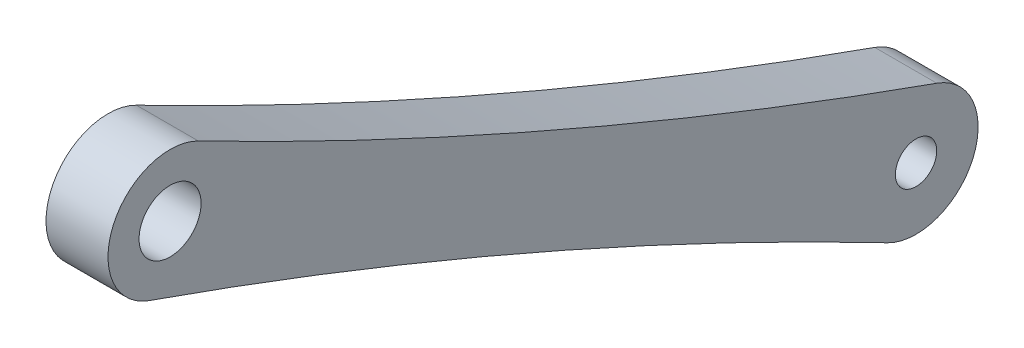
ISO-10303-21;
HEADER;
FILE_DESCRIPTION(('STEP AP214'),'2;1');
FILE_NAME('part.step','',(''),(''),'','','');
FILE_SCHEMA(('AUTOMOTIVE_DESIGN { 1 0 10303 214 1 1 1 1 }'));
ENDSEC;
DATA;
#1=APPLICATION_CONTEXT('core data for automotive mechanical design processes');
#2=APPLICATION_PROTOCOL_DEFINITION('international standard','automotive_design',2000,#1);
#3=PRODUCT_CONTEXT('',#1,'mechanical');
#4=PRODUCT('Part','Part','',(#3));
#5=PRODUCT_RELATED_PRODUCT_CATEGORY('part','',(#4));
#6=PRODUCT_DEFINITION_FORMATION('','',#4);
#7=PRODUCT_DEFINITION_CONTEXT('part definition',#1,'design');
#8=PRODUCT_DEFINITION('design','',#6,#7);
#9=PRODUCT_DEFINITION_SHAPE('','',#8);
#10=(LENGTH_UNIT() NAMED_UNIT(*) SI_UNIT(.MILLI.,.METRE.));
#11=(NAMED_UNIT(*) PLANE_ANGLE_UNIT() SI_UNIT($,.RADIAN.));
#12=(NAMED_UNIT(*) SI_UNIT($,.STERADIAN.) SOLID_ANGLE_UNIT());
#13=UNCERTAINTY_MEASURE_WITH_UNIT(LENGTH_MEASURE(1.E-05),#10,'distance_accuracy_value','');
#14=(GEOMETRIC_REPRESENTATION_CONTEXT(3) GLOBAL_UNCERTAINTY_ASSIGNED_CONTEXT((#13)) GLOBAL_UNIT_ASSIGNED_CONTEXT((#10,
#11,#12)) REPRESENTATION_CONTEXT('',''));
#15=CARTESIAN_POINT('',(0.,0.,0.));
#16=DIRECTION('',(0.,0.,1.));
#17=DIRECTION('',(1.,0.,0.));
#18=AXIS2_PLACEMENT_3D('',#15,#16,#17);
#19=CARTESIAN_POINT('',(4.5,21.8782646398546,117.17459809038));
#20=DIRECTION('',(1.,0.,0.));
#21=DIRECTION('',(0.,0.,-1.));
#22=AXIS2_PLACEMENT_3D('',#19,#20,#21);
#23=PLANE('',#22);
#24=CARTESIAN_POINT('',(4.5,51.9172732102553,39.9711419700113));
#25=DIRECTION('',(1.,0.,0.));
#26=DIRECTION('',(0.,0.,-1.));
#27=AXIS2_PLACEMENT_3D('',#24,#25,#26);
#28=CIRCLE('',#27,2.);
#29=CARTESIAN_POINT('',(4.5,51.9172732102553,37.9711419700113));
#30=VERTEX_POINT('',#29);
#31=EDGE_CURVE('E11',#30,#30,#28,.T.);
#32=ORIENTED_EDGE('',*,*,#31,.F.);
#33=EDGE_LOOP('',(#32));
#34=FACE_BOUND('',#33,.T.);
#35=CARTESIAN_POINT('',(4.5,83.1007540725639,112.120643155467));
#36=DIRECTION('',(1.,0.,0.));
#37=DIRECTION('',(0.,0.,-1.));
#38=AXIS2_PLACEMENT_3D('',#35,#36,#37);
#39=CIRCLE('',#38,3.00000000000001);
#40=CARTESIAN_POINT('',(4.5,83.1007540725639,109.120643155467));
#41=VERTEX_POINT('',#40);
#42=EDGE_CURVE('E154',#41,#41,#39,.T.);
#43=ORIENTED_EDGE('',*,*,#42,.F.);
#44=EDGE_LOOP('',(#43));
#45=FACE_BOUND('',#44,.T.);
#46=CARTESIAN_POINT('',(4.500012,603.870455787238,-155.772990334907));
#47=DIRECTION('',(1.,0.,0.));
#48=DIRECTION('',(0.,-0.889239728368869,0.457441477667319));
#49=AXIS2_PLACEMENT_3D('',#46,#47,#48);
#50=CIRCLE('',#49,579.634767656997);
#51=CARTESIAN_POINT('',(4.500006,88.4361924427772,109.375994289463));
#52=VERTEX_POINT('',#51);
#53=CARTESIAN_POINT('',(4.500006,57.5721954900773,37.965685909866));
#54=VERTEX_POINT('',#53);
#55=EDGE_CURVE('E91',#52,#54,#50,.T.);
#56=ORIENTED_EDGE('',*,*,#55,.F.);
#57=CARTESIAN_POINT('',(4.5,88.4361924427771,109.375994289463));
#58=CARTESIAN_POINT('',(4.5,89.0067273458961,110.485081084262));
#59=CARTESIAN_POINT('',(4.5,89.0880372999586,111.730208071287));
#60=CARTESIAN_POINT('',(4.5,89.1692944044217,112.974525754417));
#61=CARTESIAN_POINT('',(4.5,88.7474526666865,114.149138900381));
#62=CARTESIAN_POINT('',(4.5,88.325981742287,115.322719521158));
#63=CARTESIAN_POINT('',(4.5,87.4708925674688,116.231833924009));
#64=CARTESIAN_POINT('',(4.5,86.6165550452972,117.140149184189));
#65=CARTESIAN_POINT('',(4.5,85.4699547905982,117.633073468647));
#66=CARTESIAN_POINT('',(4.5,84.3243624367274,118.125564455804));
#67=CARTESIAN_POINT('',(4.5,83.076307236675,118.120593351278));
#68=CARTESIAN_POINT('',(4.5,81.8293491198367,118.115626616523));
#69=CARTESIAN_POINT('',(4.5,80.6867118980828,117.613584114536));
#70=CARTESIAN_POINT('',(4.5,79.5450790935612,117.111982925095));
#71=CARTESIAN_POINT('',(4.5,78.697259087272,116.196085697634));
#72=CARTESIAN_POINT('',(4.5,77.8499899289964,115.280783549512));
#73=CARTESIAN_POINT('',(4.5,77.4377130001774,114.103057292942));
#74=B_SPLINE_CURVE_WITH_KNOTS('',2,(#57,#58,#59,#60,#61,#62,#63,#64,#65,#66,#67,#68,#69,#70,#71,
#72,#73),.UNSPECIFIED.,.F.,.F.,(3,2,2,2,2,2,2,2,3),(0.,0.125,0.25,0.375,0.5,0.625,0.75,0.875,
1.),.UNSPECIFIED.);
#75=CARTESIAN_POINT('',(4.500006,77.4377130001774,114.103057292942));
#76=VERTEX_POINT('',#75);
#77=EDGE_CURVE('E103',#52,#76,#74,.T.);
#78=ORIENTED_EDGE('',*,*,#77,.T.);
#79=CARTESIAN_POINT('',(4.500012,-438.096598266388,294.571906793604));
#80=DIRECTION('',(1.,0.,0.));
#81=DIRECTION('',(0.,0.887340540482324,-0.461114698547484));
#82=AXIS2_PLACEMENT_3D('',#79,#80,#81);
#83=CIRCLE('',#82,546.209329591855);
#84=CARTESIAN_POINT('',(4.5,46.5770834701371,42.7067564350325));
#85=VERTEX_POINT('',#84);
#86=EDGE_CURVE('E151',#85,#76,#83,.T.);
#87=ORIENTED_EDGE('',*,*,#86,.F.);
#88=DIRECTION('',(0.,-0.450754172584189,-0.892648125465988));
#89=VECTOR('',#88,1.);
#90=CARTESIAN_POINT('',(4.5,46.5770834701371,42.7067564350325));
#91=LINE('',#90,#89);
#92=CARTESIAN_POINT('',(4.5,46.5613844611729,42.6756670036397));
#93=VERTEX_POINT('',#92);
#94=EDGE_CURVE('E56',#85,#93,#91,.T.);
#95=ORIENTED_EDGE('',*,*,#94,.T.);
#96=CARTESIAN_POINT('',(4.5,46.5613844574588,42.6756670055153));
#97=CARTESIAN_POINT('',(4.5,46.001231409434,41.5663715209565));
#98=CARTESIAN_POINT('',(4.5,45.9277343814501,40.3252953523683));
#99=CARTESIAN_POINT('',(4.5,45.8542853039386,39.0850288789494));
#100=CARTESIAN_POINT('',(4.5,46.2799889048214,37.9166284850936));
#101=CARTESIAN_POINT('',(4.5,46.7053169349145,36.7492588954352));
#102=CARTESIAN_POINT('',(4.5,47.5601653740378,35.8461436301847));
#103=CARTESIAN_POINT('',(4.5,48.414259635586,34.9438251252132));
#104=CARTESIAN_POINT('',(4.5,49.5575410765345,34.4546517581932));
#105=CARTESIAN_POINT('',(4.5,50.6998138741215,33.9659099572352));
#106=CARTESIAN_POINT('',(4.5,51.9433391318092,33.971198589634));
#107=CARTESIAN_POINT('',(4.5,53.1857673075214,33.9764825562142));
#108=CARTESIAN_POINT('',(4.5,54.3248466210351,34.4753626556914));
#109=CARTESIAN_POINT('',(4.5,55.4629209984723,34.9738026254921));
#110=CARTESIAN_POINT('',(4.5,56.3100568715458,35.8841563197919));
#111=CARTESIAN_POINT('',(4.5,57.1566402783085,36.7939163197825));
#112=CARTESIAN_POINT('',(4.5,57.5721954900772,37.965685909866));
#113=B_SPLINE_CURVE_WITH_KNOTS('',2,(#96,#97,#98,#99,#100,#101,#102,#103,#104,#105,#106,#107,
#108,#109,#110,#111,#112),.UNSPECIFIED.,.F.,.F.,(3,2,2,2,2,2,2,2,3),(0.,0.125,0.25,0.375,0.5,
0.625,0.75,0.875,1.),.UNSPECIFIED.);
#114=EDGE_CURVE('E119',#93,#54,#113,.T.);
#115=ORIENTED_EDGE('',*,*,#114,.T.);
#116=EDGE_LOOP('',(#56,#78,#87,#95,#115));
#117=FACE_BOUND('',#116,.T.);
#118=ADVANCED_FACE('F45',(#34,#45,#117),#23,.T.);
#119=CARTESIAN_POINT('',(-1.5,21.8782646398546,117.17459809038));
#120=DIRECTION('',(1.,0.,0.));
#121=DIRECTION('',(0.,0.,-1.));
#122=AXIS2_PLACEMENT_3D('',#119,#120,#121);
#123=PLANE('',#122);
#124=CARTESIAN_POINT('',(-1.5,51.9172732102553,39.9711419700113));
#125=DIRECTION('',(1.,0.,0.));
#126=DIRECTION('',(0.,0.,-1.));
#127=AXIS2_PLACEMENT_3D('',#124,#125,#126);
#128=CIRCLE('',#127,2.);
#129=CARTESIAN_POINT('',(-1.5,51.9172732102553,37.9711419700113));
#130=VERTEX_POINT('',#129);
#131=EDGE_CURVE('E51',#130,#130,#128,.T.);
#132=ORIENTED_EDGE('',*,*,#131,.T.);
#133=EDGE_LOOP('',(#132));
#134=FACE_BOUND('',#133,.T.);
#135=CARTESIAN_POINT('',(-1.5,83.1007540725639,112.120643155467));
#136=DIRECTION('',(1.,0.,0.));
#137=DIRECTION('',(0.,0.,-1.));
#138=AXIS2_PLACEMENT_3D('',#135,#136,#137);
#139=CIRCLE('',#138,3.00000000000001);
#140=CARTESIAN_POINT('',(-1.5,83.1007540725639,109.120643155467));
#141=VERTEX_POINT('',#140);
#142=EDGE_CURVE('E153',#141,#141,#139,.T.);
#143=ORIENTED_EDGE('',*,*,#142,.T.);
#144=EDGE_LOOP('',(#143));
#145=FACE_BOUND('',#144,.T.);
#146=CARTESIAN_POINT('',(-1.5,83.1007540725639,112.120643155467));
#147=DIRECTION('',(1.,0.,0.));
#148=DIRECTION('',(0.,0.,-1.));
#149=AXIS2_PLACEMENT_3D('',#146,#147,#148);
#150=CIRCLE('',#149,6.00000000000003);
#151=CARTESIAN_POINT('',(-1.5,88.4361924427771,109.375994289463));
#152=VERTEX_POINT('',#151);
#153=CARTESIAN_POINT('',(-1.5,77.4377130001774,114.103057292942));
#154=VERTEX_POINT('',#153);
#155=EDGE_CURVE('E240',#152,#154,#150,.T.);
#156=ORIENTED_EDGE('',*,*,#155,.F.);
#157=CARTESIAN_POINT('',(-1.5,603.870455787238,-155.772990334907));
#158=DIRECTION('',(1.,0.,0.));
#159=DIRECTION('',(0.,0.,-1.));
#160=AXIS2_PLACEMENT_3D('',#157,#158,#159);
#161=CIRCLE('',#160,579.634767656997);
#162=CARTESIAN_POINT('',(-1.5,57.5721954900772,37.965685909866));
#163=VERTEX_POINT('',#162);
#164=EDGE_CURVE('E100',#152,#163,#161,.T.);
#165=ORIENTED_EDGE('',*,*,#164,.T.);
#166=CARTESIAN_POINT('',(-1.5,51.9172732102553,39.9711419700113));
#167=DIRECTION('',(1.,0.,0.));
#168=DIRECTION('',(0.,0.,-1.));
#169=AXIS2_PLACEMENT_3D('',#166,#167,#168);
#170=CIRCLE('',#169,6.);
#171=CARTESIAN_POINT('',(-1.5,46.5613844611729,42.6756670036397));
#172=VERTEX_POINT('',#171);
#173=EDGE_CURVE('E241',#172,#163,#170,.T.);
#174=ORIENTED_EDGE('',*,*,#173,.F.);
#175=DIRECTION('',(0.,-0.450754172583991,-0.892648125466089));
#176=VECTOR('',#175,1.);
#177=CARTESIAN_POINT('',(-1.5,19.9298847503802,-10.0638520981168));
#178=LINE('',#177,#176);
#179=CARTESIAN_POINT('',(-1.5,46.5770834701371,42.7067564350325));
#180=VERTEX_POINT('',#179);
#181=EDGE_CURVE('E248',#180,#172,#178,.T.);
#182=ORIENTED_EDGE('',*,*,#181,.F.);
#183=CARTESIAN_POINT('',(-1.5,-438.096598266388,294.571906793604));
#184=DIRECTION('',(1.,0.,0.));
#185=DIRECTION('',(0.,0.,-1.));
#186=AXIS2_PLACEMENT_3D('',#183,#184,#185);
#187=CIRCLE('',#186,546.209329591855);
#188=EDGE_CURVE('E99',#180,#154,#187,.T.);
#189=ORIENTED_EDGE('',*,*,#188,.T.);
#190=EDGE_LOOP('',(#156,#165,#174,#182,#189));
#191=FACE_BOUND('',#190,.T.);
#192=ADVANCED_FACE('F42',(#134,#145,#191),#123,.F.);
#193=CARTESIAN_POINT('',(4.5,51.9172732102553,39.9711419700113));
#194=DIRECTION('',(-1.,0.,0.));
#195=DIRECTION('',(0.,0.,1.));
#196=AXIS2_PLACEMENT_3D('',#193,#194,#195);
#197=CYLINDRICAL_SURFACE('',#196,2.);
#198=ORIENTED_EDGE('',*,*,#31,.T.);
#199=EDGE_LOOP('',(#198));
#200=FACE_BOUND('',#199,.T.);
#201=ORIENTED_EDGE('',*,*,#131,.F.);
#202=EDGE_LOOP('',(#201));
#203=FACE_BOUND('',#202,.T.);
#204=ADVANCED_FACE('F133',(#200,#203),#197,.F.);
#205=CARTESIAN_POINT('',(-1.5,83.1007540725639,112.120643155467));
#206=DIRECTION('',(1.,0.,0.));
#207=DIRECTION('',(0.,0.,-1.));
#208=AXIS2_PLACEMENT_3D('',#205,#206,#207);
#209=CYLINDRICAL_SURFACE('',#208,3.00000000000001);
#210=ORIENTED_EDGE('',*,*,#142,.F.);
#211=EDGE_LOOP('',(#210));
#212=FACE_BOUND('',#211,.T.);
#213=ORIENTED_EDGE('',*,*,#42,.T.);
#214=EDGE_LOOP('',(#213));
#215=FACE_BOUND('',#214,.T.);
#216=ADVANCED_FACE('F222',(#212,#215),#209,.F.);
#217=CARTESIAN_POINT('',(-1.5,83.1007540725639,112.120643155467));
#218=DIRECTION('',(1.,0.,0.));
#219=DIRECTION('',(0.,0.,-1.));
#220=AXIS2_PLACEMENT_3D('',#217,#218,#219);
#221=CYLINDRICAL_SURFACE('',#220,6.00000000000003);
#222=DIRECTION('',(1.,0.,0.));
#223=VECTOR('',#222,1.);
#224=CARTESIAN_POINT('',(-1.5,88.4361924427771,109.375994289463));
#225=LINE('',#224,#223);
#226=EDGE_CURVE('E90',#152,#52,#225,.T.);
#227=ORIENTED_EDGE('',*,*,#226,.F.);
#228=ORIENTED_EDGE('',*,*,#155,.T.);
#229=DIRECTION('',(1.,0.,0.));
#230=VECTOR('',#229,1.);
#231=CARTESIAN_POINT('',(-1.5,77.4377130001774,114.103057292942));
#232=LINE('',#231,#230);
#233=EDGE_CURVE('E110',#154,#76,#232,.T.);
#234=ORIENTED_EDGE('',*,*,#233,.T.);
#235=ORIENTED_EDGE('',*,*,#77,.F.);
#236=EDGE_LOOP('',(#227,#228,#234,#235));
#237=FACE_BOUND('',#236,.T.);
#238=ADVANCED_FACE('F104',(#237),#221,.T.);
#239=CARTESIAN_POINT('',(-1.5,-438.096598266388,294.571906793604));
#240=DIRECTION('',(1.,0.,0.));
#241=DIRECTION('',(0.,0.,-1.));
#242=AXIS2_PLACEMENT_3D('',#239,#240,#241);
#243=CYLINDRICAL_SURFACE('',#242,546.209329591855);
#244=ORIENTED_EDGE('',*,*,#233,.F.);
#245=ORIENTED_EDGE('',*,*,#188,.F.);
#246=DIRECTION('',(1.,0.,0.));
#247=VECTOR('',#246,1.);
#248=CARTESIAN_POINT('',(-1.5,46.5770834701371,42.7067564350325));
#249=LINE('',#248,#247);
#250=EDGE_CURVE('E209',#180,#85,#249,.T.);
#251=ORIENTED_EDGE('',*,*,#250,.T.);
#252=ORIENTED_EDGE('',*,*,#86,.T.);
#253=EDGE_LOOP('',(#244,#245,#251,#252));
#254=FACE_BOUND('',#253,.T.);
#255=ADVANCED_FACE('F164',(#254),#243,.F.);
#256=CARTESIAN_POINT('',(-1.5,19.9298847503802,-10.0638520981168));
#257=DIRECTION('',(0.,-0.892648125466088,0.450754172583991));
#258=DIRECTION('',(0.,-0.450754172583991,-0.892648125466089));
#259=AXIS2_PLACEMENT_3D('',#256,#257,#258);
#260=PLANE('',#259);
#261=ORIENTED_EDGE('',*,*,#94,.F.);
#262=ORIENTED_EDGE('',*,*,#250,.F.);
#263=ORIENTED_EDGE('',*,*,#181,.T.);
#264=DIRECTION('',(1.,0.,0.));
#265=VECTOR('',#264,1.);
#266=CARTESIAN_POINT('',(-1.5,46.5613844611729,42.6756670036397));
#267=LINE('',#266,#265);
#268=EDGE_CURVE('E196',#172,#93,#267,.T.);
#269=ORIENTED_EDGE('',*,*,#268,.T.);
#270=EDGE_LOOP('',(#261,#262,#263,#269));
#271=FACE_BOUND('',#270,.T.);
#272=ADVANCED_FACE('F173',(#271),#260,.T.);
#273=CARTESIAN_POINT('',(-1.5,51.9172732102553,39.9711419700113));
#274=DIRECTION('',(1.,0.,0.));
#275=DIRECTION('',(0.,0.,-1.));
#276=AXIS2_PLACEMENT_3D('',#273,#274,#275);
#277=CYLINDRICAL_SURFACE('',#276,6.);
#278=ORIENTED_EDGE('',*,*,#268,.F.);
#279=ORIENTED_EDGE('',*,*,#173,.T.);
#280=DIRECTION('',(1.,0.,0.));
#281=VECTOR('',#280,1.);
#282=CARTESIAN_POINT('',(-1.5,57.5721954900772,37.965685909866));
#283=LINE('',#282,#281);
#284=EDGE_CURVE('E70',#163,#54,#283,.T.);
#285=ORIENTED_EDGE('',*,*,#284,.T.);
#286=ORIENTED_EDGE('',*,*,#114,.F.);
#287=EDGE_LOOP('',(#278,#279,#285,#286));
#288=FACE_BOUND('',#287,.T.);
#289=ADVANCED_FACE('F176',(#288),#277,.T.);
#290=CARTESIAN_POINT('',(-1.5,603.870455787238,-155.772990334907));
#291=DIRECTION('',(1.,0.,0.));
#292=DIRECTION('',(0.,0.,-1.));
#293=AXIS2_PLACEMENT_3D('',#290,#291,#292);
#294=CYLINDRICAL_SURFACE('',#293,579.634767656997);
#295=ORIENTED_EDGE('',*,*,#284,.F.);
#296=ORIENTED_EDGE('',*,*,#164,.F.);
#297=ORIENTED_EDGE('',*,*,#226,.T.);
#298=ORIENTED_EDGE('',*,*,#55,.T.);
#299=EDGE_LOOP('',(#295,#296,#297,#298));
#300=FACE_BOUND('',#299,.T.);
#301=ADVANCED_FACE('F93',(#300),#294,.F.);
#302=CLOSED_SHELL('',(#118,#192,#204,#216,#238,#255,#272,#289,#301));
#303=MANIFOLD_SOLID_BREP('B2',#302);
#304=ADVANCED_BREP_SHAPE_REPRESENTATION('',(#18,#303),#14);
#305=SHAPE_DEFINITION_REPRESENTATION(#9,#304);
ENDSEC;
END-ISO-10303-21;
